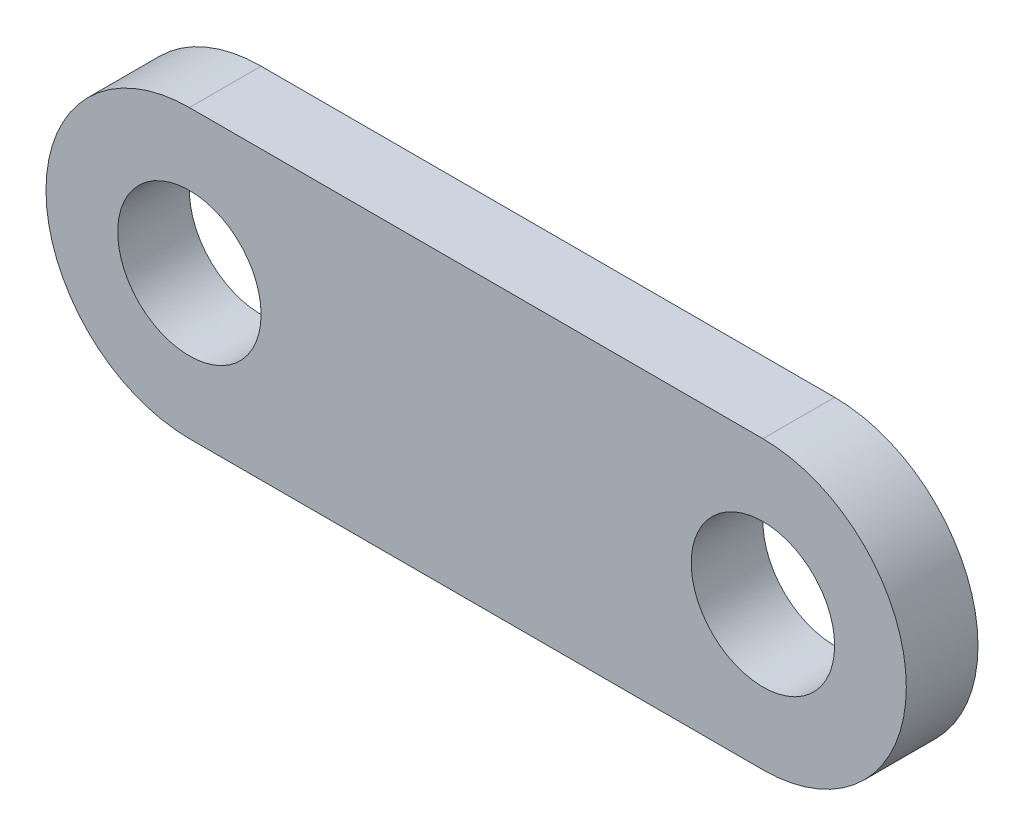
ISO-10303-21;
HEADER;
FILE_DESCRIPTION(('STEP AP214'),'2;1');
FILE_NAME('part.step','',(''),(''),'','','');
FILE_SCHEMA(('AUTOMOTIVE_DESIGN { 1 0 10303 214 1 1 1 1 }'));
ENDSEC;
DATA;
#1=APPLICATION_CONTEXT('core data for automotive mechanical design processes');
#2=APPLICATION_PROTOCOL_DEFINITION('international standard','automotive_design',2000,#1);
#3=PRODUCT_CONTEXT('',#1,'mechanical');
#4=PRODUCT('Part','Part','',(#3));
#5=PRODUCT_RELATED_PRODUCT_CATEGORY('part','',(#4));
#6=PRODUCT_DEFINITION_FORMATION('','',#4);
#7=PRODUCT_DEFINITION_CONTEXT('part definition',#1,'design');
#8=PRODUCT_DEFINITION('design','',#6,#7);
#9=PRODUCT_DEFINITION_SHAPE('','',#8);
#10=(LENGTH_UNIT() NAMED_UNIT(*) SI_UNIT(.MILLI.,.METRE.));
#11=(NAMED_UNIT(*) PLANE_ANGLE_UNIT() SI_UNIT($,.RADIAN.));
#12=(NAMED_UNIT(*) SI_UNIT($,.STERADIAN.) SOLID_ANGLE_UNIT());
#13=UNCERTAINTY_MEASURE_WITH_UNIT(LENGTH_MEASURE(1.E-05),#10,'distance_accuracy_value','');
#14=(GEOMETRIC_REPRESENTATION_CONTEXT(3) GLOBAL_UNCERTAINTY_ASSIGNED_CONTEXT((#13)) GLOBAL_UNIT_ASSIGNED_CONTEXT((#10,
#11,#12)) REPRESENTATION_CONTEXT('',''));
#15=CARTESIAN_POINT('',(0.,0.,0.));
#16=DIRECTION('',(0.,0.,1.));
#17=DIRECTION('',(1.,0.,0.));
#18=AXIS2_PLACEMENT_3D('',#15,#16,#17);
#19=CARTESIAN_POINT('',(20.,0.,5.));
#20=DIRECTION('',(0.,0.,1.));
#21=DIRECTION('',(1.,0.,0.));
#22=AXIS2_PLACEMENT_3D('',#19,#20,#21);
#23=PLANE('',#22);
#24=CARTESIAN_POINT('',(-20.,0.,5.));
#25=DIRECTION('',(0.,0.,1.));
#26=DIRECTION('',(1.,0.,0.));
#27=AXIS2_PLACEMENT_3D('',#24,#25,#26);
#28=CIRCLE('',#27,5.);
#29=CARTESIAN_POINT('',(-15.,0.,5.));
#30=VERTEX_POINT('',#29);
#31=EDGE_CURVE('E100',#30,#30,#28,.T.);
#32=ORIENTED_EDGE('',*,*,#31,.F.);
#33=EDGE_LOOP('',(#32));
#34=FACE_BOUND('',#33,.T.);
#35=CARTESIAN_POINT('',(20.,0.,5.));
#36=DIRECTION('',(0.,0.,1.));
#37=DIRECTION('',(1.,0.,0.));
#38=AXIS2_PLACEMENT_3D('',#35,#36,#37);
#39=CIRCLE('',#38,10.);
#40=CARTESIAN_POINT('',(20.,-9.99999999999999,5.));
#41=VERTEX_POINT('',#40);
#42=CARTESIAN_POINT('',(20.,10.,5.));
#43=VERTEX_POINT('',#42);
#44=EDGE_CURVE('E85',#41,#43,#39,.T.);
#45=ORIENTED_EDGE('',*,*,#44,.T.);
#46=DIRECTION('',(-1.,0.,0.));
#47=VECTOR('',#46,1.);
#48=CARTESIAN_POINT('',(20.,10.,5.));
#49=LINE('',#48,#47);
#50=CARTESIAN_POINT('',(-20.,10.,5.));
#51=VERTEX_POINT('',#50);
#52=EDGE_CURVE('E80',#43,#51,#49,.T.);
#53=ORIENTED_EDGE('',*,*,#52,.T.);
#54=CARTESIAN_POINT('',(-20.,0.,5.));
#55=DIRECTION('',(0.,0.,1.));
#56=DIRECTION('',(1.,0.,0.));
#57=AXIS2_PLACEMENT_3D('',#54,#55,#56);
#58=CIRCLE('',#57,10.);
#59=CARTESIAN_POINT('',(-20.,-9.99999999999999,5.));
#60=VERTEX_POINT('',#59);
#61=EDGE_CURVE('E83',#51,#60,#58,.T.);
#62=ORIENTED_EDGE('',*,*,#61,.T.);
#63=DIRECTION('',(1.,0.,0.));
#64=VECTOR('',#63,1.);
#65=CARTESIAN_POINT('',(20.,-9.99999999999999,5.));
#66=LINE('',#65,#64);
#67=EDGE_CURVE('E50',#60,#41,#66,.T.);
#68=ORIENTED_EDGE('',*,*,#67,.T.);
#69=EDGE_LOOP('',(#45,#53,#62,#68));
#70=FACE_BOUND('',#69,.T.);
#71=CARTESIAN_POINT('',(20.,0.,5.));
#72=DIRECTION('',(0.,0.,1.));
#73=DIRECTION('',(1.,0.,0.));
#74=AXIS2_PLACEMENT_3D('',#71,#72,#73);
#75=CIRCLE('',#74,5.);
#76=CARTESIAN_POINT('',(25.,0.,5.));
#77=VERTEX_POINT('',#76);
#78=EDGE_CURVE('E115',#77,#77,#75,.T.);
#79=ORIENTED_EDGE('',*,*,#78,.F.);
#80=EDGE_LOOP('',(#79));
#81=FACE_BOUND('',#80,.T.);
#82=ADVANCED_FACE('F33',(#34,#70,#81),#23,.T.);
#83=CARTESIAN_POINT('',(20.,0.,0.));
#84=DIRECTION('',(0.,0.,1.));
#85=DIRECTION('',(1.,0.,0.));
#86=AXIS2_PLACEMENT_3D('',#83,#84,#85);
#87=PLANE('',#86);
#88=CARTESIAN_POINT('',(20.,0.,0.));
#89=DIRECTION('',(0.,0.,1.));
#90=DIRECTION('',(1.,0.,0.));
#91=AXIS2_PLACEMENT_3D('',#88,#89,#90);
#92=CIRCLE('',#91,10.);
#93=CARTESIAN_POINT('',(20.,-9.99999999999999,0.));
#94=VERTEX_POINT('',#93);
#95=CARTESIAN_POINT('',(20.,10.,0.));
#96=VERTEX_POINT('',#95);
#97=EDGE_CURVE('E97',#94,#96,#92,.T.);
#98=ORIENTED_EDGE('',*,*,#97,.F.);
#99=DIRECTION('',(1.,0.,0.));
#100=VECTOR('',#99,1.);
#101=CARTESIAN_POINT('',(20.,-9.99999999999999,0.));
#102=LINE('',#101,#100);
#103=CARTESIAN_POINT('',(-20.,-9.99999999999999,0.));
#104=VERTEX_POINT('',#103);
#105=EDGE_CURVE('E73',#104,#94,#102,.T.);
#106=ORIENTED_EDGE('',*,*,#105,.F.);
#107=CARTESIAN_POINT('',(-20.,0.,0.));
#108=DIRECTION('',(0.,0.,1.));
#109=DIRECTION('',(1.,0.,0.));
#110=AXIS2_PLACEMENT_3D('',#107,#108,#109);
#111=CIRCLE('',#110,10.);
#112=CARTESIAN_POINT('',(-20.,10.,0.));
#113=VERTEX_POINT('',#112);
#114=EDGE_CURVE('E67',#113,#104,#111,.T.);
#115=ORIENTED_EDGE('',*,*,#114,.F.);
#116=DIRECTION('',(-1.,0.,0.));
#117=VECTOR('',#116,1.);
#118=CARTESIAN_POINT('',(20.,10.,0.));
#119=LINE('',#118,#117);
#120=EDGE_CURVE('E89',#96,#113,#119,.T.);
#121=ORIENTED_EDGE('',*,*,#120,.F.);
#122=EDGE_LOOP('',(#98,#106,#115,#121));
#123=FACE_BOUND('',#122,.T.);
#124=CARTESIAN_POINT('',(-20.,0.,0.));
#125=DIRECTION('',(0.,0.,1.));
#126=DIRECTION('',(1.,0.,0.));
#127=AXIS2_PLACEMENT_3D('',#124,#125,#126);
#128=CIRCLE('',#127,5.);
#129=CARTESIAN_POINT('',(-15.,0.,0.));
#130=VERTEX_POINT('',#129);
#131=EDGE_CURVE('E112',#130,#130,#128,.T.);
#132=ORIENTED_EDGE('',*,*,#131,.T.);
#133=EDGE_LOOP('',(#132));
#134=FACE_BOUND('',#133,.T.);
#135=CARTESIAN_POINT('',(20.,0.,0.));
#136=DIRECTION('',(0.,0.,1.));
#137=DIRECTION('',(1.,0.,0.));
#138=AXIS2_PLACEMENT_3D('',#135,#136,#137);
#139=CIRCLE('',#138,5.);
#140=CARTESIAN_POINT('',(25.,0.,0.));
#141=VERTEX_POINT('',#140);
#142=EDGE_CURVE('E118',#141,#141,#139,.T.);
#143=ORIENTED_EDGE('',*,*,#142,.T.);
#144=EDGE_LOOP('',(#143));
#145=FACE_BOUND('',#144,.T.);
#146=ADVANCED_FACE('F108',(#123,#134,#145),#87,.F.);
#147=CARTESIAN_POINT('',(20.,0.,5.));
#148=DIRECTION('',(0.,0.,-1.));
#149=DIRECTION('',(-1.,0.,0.));
#150=AXIS2_PLACEMENT_3D('',#147,#148,#149);
#151=CYLINDRICAL_SURFACE('',#150,10.);
#152=ORIENTED_EDGE('',*,*,#97,.T.);
#153=DIRECTION('',(0.,0.,-1.));
#154=VECTOR('',#153,1.);
#155=CARTESIAN_POINT('',(20.,10.,5.));
#156=LINE('',#155,#154);
#157=EDGE_CURVE('E11',#43,#96,#156,.T.);
#158=ORIENTED_EDGE('',*,*,#157,.F.);
#159=ORIENTED_EDGE('',*,*,#44,.F.);
#160=DIRECTION('',(0.,0.,-1.));
#161=VECTOR('',#160,1.);
#162=CARTESIAN_POINT('',(20.,-9.99999999999999,5.));
#163=LINE('',#162,#161);
#164=EDGE_CURVE('E93',#41,#94,#163,.T.);
#165=ORIENTED_EDGE('',*,*,#164,.T.);
#166=EDGE_LOOP('',(#152,#158,#159,#165));
#167=FACE_BOUND('',#166,.T.);
#168=ADVANCED_FACE('F35',(#167),#151,.T.);
#169=CARTESIAN_POINT('',(20.,10.,5.));
#170=DIRECTION('',(0.,-1.,0.));
#171=DIRECTION('',(1.,0.,0.));
#172=AXIS2_PLACEMENT_3D('',#169,#170,#171);
#173=PLANE('',#172);
#174=ORIENTED_EDGE('',*,*,#120,.T.);
#175=DIRECTION('',(0.,0.,-1.));
#176=VECTOR('',#175,1.);
#177=CARTESIAN_POINT('',(-20.,10.,5.));
#178=LINE('',#177,#176);
#179=EDGE_CURVE('E42',#51,#113,#178,.T.);
#180=ORIENTED_EDGE('',*,*,#179,.F.);
#181=ORIENTED_EDGE('',*,*,#52,.F.);
#182=ORIENTED_EDGE('',*,*,#157,.T.);
#183=EDGE_LOOP('',(#174,#180,#181,#182));
#184=FACE_BOUND('',#183,.T.);
#185=ADVANCED_FACE('F88',(#184),#173,.F.);
#186=CARTESIAN_POINT('',(-20.,0.,5.));
#187=DIRECTION('',(0.,0.,-1.));
#188=DIRECTION('',(-1.,0.,0.));
#189=AXIS2_PLACEMENT_3D('',#186,#187,#188);
#190=CYLINDRICAL_SURFACE('',#189,10.);
#191=ORIENTED_EDGE('',*,*,#114,.T.);
#192=DIRECTION('',(0.,0.,-1.));
#193=VECTOR('',#192,1.);
#194=CARTESIAN_POINT('',(-20.,-9.99999999999999,5.));
#195=LINE('',#194,#193);
#196=EDGE_CURVE('E90',#60,#104,#195,.T.);
#197=ORIENTED_EDGE('',*,*,#196,.F.);
#198=ORIENTED_EDGE('',*,*,#61,.F.);
#199=ORIENTED_EDGE('',*,*,#179,.T.);
#200=EDGE_LOOP('',(#191,#197,#198,#199));
#201=FACE_BOUND('',#200,.T.);
#202=ADVANCED_FACE('F91',(#201),#190,.T.);
#203=CARTESIAN_POINT('',(20.,-9.99999999999999,5.));
#204=DIRECTION('',(0.,1.,0.));
#205=DIRECTION('',(-1.,0.,0.));
#206=AXIS2_PLACEMENT_3D('',#203,#204,#205);
#207=PLANE('',#206);
#208=ORIENTED_EDGE('',*,*,#105,.T.);
#209=ORIENTED_EDGE('',*,*,#164,.F.);
#210=ORIENTED_EDGE('',*,*,#67,.F.);
#211=ORIENTED_EDGE('',*,*,#196,.T.);
#212=EDGE_LOOP('',(#208,#209,#210,#211));
#213=FACE_BOUND('',#212,.T.);
#214=ADVANCED_FACE('F105',(#213),#207,.F.);
#215=CARTESIAN_POINT('',(-20.,0.,5.));
#216=DIRECTION('',(0.,0.,-1.));
#217=DIRECTION('',(-1.,0.,0.));
#218=AXIS2_PLACEMENT_3D('',#215,#216,#217);
#219=CYLINDRICAL_SURFACE('',#218,5.);
#220=ORIENTED_EDGE('',*,*,#31,.T.);
#221=EDGE_LOOP('',(#220));
#222=FACE_BOUND('',#221,.T.);
#223=ORIENTED_EDGE('',*,*,#131,.F.);
#224=EDGE_LOOP('',(#223));
#225=FACE_BOUND('',#224,.T.);
#226=ADVANCED_FACE('F135',(#222,#225),#219,.F.);
#227=CARTESIAN_POINT('',(20.,0.,5.));
#228=DIRECTION('',(0.,0.,-1.));
#229=DIRECTION('',(-1.,0.,0.));
#230=AXIS2_PLACEMENT_3D('',#227,#228,#229);
#231=CYLINDRICAL_SURFACE('',#230,5.);
#232=ORIENTED_EDGE('',*,*,#78,.T.);
#233=EDGE_LOOP('',(#232));
#234=FACE_BOUND('',#233,.T.);
#235=ORIENTED_EDGE('',*,*,#142,.F.);
#236=EDGE_LOOP('',(#235));
#237=FACE_BOUND('',#236,.T.);
#238=ADVANCED_FACE('F124',(#234,#237),#231,.F.);
#239=CLOSED_SHELL('',(#82,#146,#168,#185,#202,#214,#226,#238));
#240=MANIFOLD_SOLID_BREP('B2',#239);
#241=ADVANCED_BREP_SHAPE_REPRESENTATION('',(#18,#240),#14);
#242=SHAPE_DEFINITION_REPRESENTATION(#9,#241);
ENDSEC;
END-ISO-10303-21;
